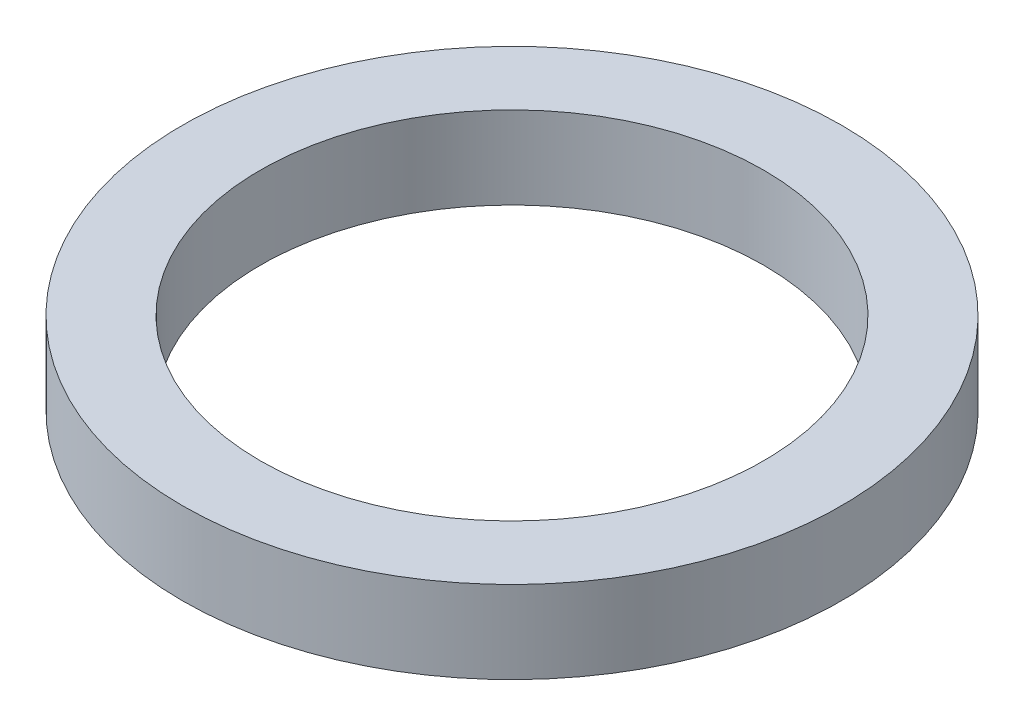
ISO-10303-21;
HEADER;
FILE_DESCRIPTION(('STEP AP214'),'2;1');
FILE_NAME('part.step','',(''),(''),'','','');
FILE_SCHEMA(('AUTOMOTIVE_DESIGN { 1 0 10303 214 1 1 1 1 }'));
ENDSEC;
DATA;
#1=APPLICATION_CONTEXT('core data for automotive mechanical design processes');
#2=APPLICATION_PROTOCOL_DEFINITION('international standard','automotive_design',2000,#1);
#3=PRODUCT_CONTEXT('',#1,'mechanical');
#4=PRODUCT('Part','Part','',(#3));
#5=PRODUCT_RELATED_PRODUCT_CATEGORY('part','',(#4));
#6=PRODUCT_DEFINITION_FORMATION('','',#4);
#7=PRODUCT_DEFINITION_CONTEXT('part definition',#1,'design');
#8=PRODUCT_DEFINITION('design','',#6,#7);
#9=PRODUCT_DEFINITION_SHAPE('','',#8);
#10=(LENGTH_UNIT() NAMED_UNIT(*) SI_UNIT(.MILLI.,.METRE.));
#11=(NAMED_UNIT(*) PLANE_ANGLE_UNIT() SI_UNIT($,.RADIAN.));
#12=(NAMED_UNIT(*) SI_UNIT($,.STERADIAN.) SOLID_ANGLE_UNIT());
#13=UNCERTAINTY_MEASURE_WITH_UNIT(LENGTH_MEASURE(1.E-05),#10,'distance_accuracy_value','');
#14=(GEOMETRIC_REPRESENTATION_CONTEXT(3) GLOBAL_UNCERTAINTY_ASSIGNED_CONTEXT((#13)) GLOBAL_UNIT_ASSIGNED_CONTEXT((#10,
#11,#12)) REPRESENTATION_CONTEXT('',''));
#15=CARTESIAN_POINT('',(0.,0.,0.));
#16=DIRECTION('',(0.,0.,1.));
#17=DIRECTION('',(1.,0.,0.));
#18=AXIS2_PLACEMENT_3D('',#15,#16,#17);
#19=CARTESIAN_POINT('',(0.,4.5,0.));
#20=DIRECTION('',(0.,1.,0.));
#21=DIRECTION('',(0.,0.,1.));
#22=AXIS2_PLACEMENT_3D('',#19,#20,#21);
#23=PLANE('',#22);
#24=CARTESIAN_POINT('',(0.,4.5,0.));
#25=DIRECTION('',(0.,1.,0.));
#26=DIRECTION('',(0.,0.,1.));
#27=AXIS2_PLACEMENT_3D('',#24,#25,#26);
#28=CIRCLE('',#27,36.);
#29=CARTESIAN_POINT('',(0.,4.5,36.));
#30=VERTEX_POINT('',#29);
#31=EDGE_CURVE('E10',#30,#30,#28,.T.);
#32=ORIENTED_EDGE('',*,*,#31,.T.);
#33=EDGE_LOOP('',(#32));
#34=FACE_BOUND('',#33,.T.);
#35=CARTESIAN_POINT('',(0.,4.5,0.));
#36=DIRECTION('',(0.,1.,0.));
#37=DIRECTION('',(0.,0.,1.));
#38=AXIS2_PLACEMENT_3D('',#35,#36,#37);
#39=CIRCLE('',#38,27.5);
#40=CARTESIAN_POINT('',(0.,4.5,27.5));
#41=VERTEX_POINT('',#40);
#42=EDGE_CURVE('E48',#41,#41,#39,.T.);
#43=ORIENTED_EDGE('',*,*,#42,.F.);
#44=EDGE_LOOP('',(#43));
#45=FACE_BOUND('',#44,.T.);
#46=ADVANCED_FACE('F37',(#34,#45),#23,.T.);
#47=CARTESIAN_POINT('',(0.,-4.5,0.));
#48=DIRECTION('',(0.,1.,0.));
#49=DIRECTION('',(0.,0.,1.));
#50=AXIS2_PLACEMENT_3D('',#47,#48,#49);
#51=PLANE('',#50);
#52=CARTESIAN_POINT('',(0.,-4.5,0.));
#53=DIRECTION('',(0.,1.,0.));
#54=DIRECTION('',(0.,0.,1.));
#55=AXIS2_PLACEMENT_3D('',#52,#53,#54);
#56=CIRCLE('',#55,36.);
#57=CARTESIAN_POINT('',(0.,-4.5,36.));
#58=VERTEX_POINT('',#57);
#59=EDGE_CURVE('E41',#58,#58,#56,.T.);
#60=ORIENTED_EDGE('',*,*,#59,.F.);
#61=EDGE_LOOP('',(#60));
#62=FACE_BOUND('',#61,.T.);
#63=CARTESIAN_POINT('',(0.,-4.5,0.));
#64=DIRECTION('',(0.,1.,0.));
#65=DIRECTION('',(0.,0.,1.));
#66=AXIS2_PLACEMENT_3D('',#63,#64,#65);
#67=CIRCLE('',#66,27.5);
#68=CARTESIAN_POINT('',(0.,-4.5,27.5));
#69=VERTEX_POINT('',#68);
#70=EDGE_CURVE('E50',#69,#69,#67,.T.);
#71=ORIENTED_EDGE('',*,*,#70,.T.);
#72=EDGE_LOOP('',(#71));
#73=FACE_BOUND('',#72,.T.);
#74=ADVANCED_FACE('F60',(#62,#73),#51,.F.);
#75=CARTESIAN_POINT('',(0.,4.5,0.));
#76=DIRECTION('',(0.,-1.,0.));
#77=DIRECTION('',(0.,0.,-1.));
#78=AXIS2_PLACEMENT_3D('',#75,#76,#77);
#79=CYLINDRICAL_SURFACE('',#78,36.);
#80=ORIENTED_EDGE('',*,*,#31,.F.);
#81=EDGE_LOOP('',(#80));
#82=FACE_BOUND('',#81,.T.);
#83=ORIENTED_EDGE('',*,*,#59,.T.);
#84=EDGE_LOOP('',(#83));
#85=FACE_BOUND('',#84,.T.);
#86=ADVANCED_FACE('F39',(#82,#85),#79,.T.);
#87=CARTESIAN_POINT('',(0.,4.5,0.));
#88=DIRECTION('',(0.,-1.,0.));
#89=DIRECTION('',(0.,0.,-1.));
#90=AXIS2_PLACEMENT_3D('',#87,#88,#89);
#91=CYLINDRICAL_SURFACE('',#90,27.5);
#92=ORIENTED_EDGE('',*,*,#42,.T.);
#93=EDGE_LOOP('',(#92));
#94=FACE_BOUND('',#93,.T.);
#95=ORIENTED_EDGE('',*,*,#70,.F.);
#96=EDGE_LOOP('',(#95));
#97=FACE_BOUND('',#96,.T.);
#98=ADVANCED_FACE('F56',(#94,#97),#91,.F.);
#99=CLOSED_SHELL('',(#46,#74,#86,#98));
#100=MANIFOLD_SOLID_BREP('B2',#99);
#101=ADVANCED_BREP_SHAPE_REPRESENTATION('',(#18,#100),#14);
#102=SHAPE_DEFINITION_REPRESENTATION(#9,#101);
ENDSEC;
END-ISO-10303-21;
